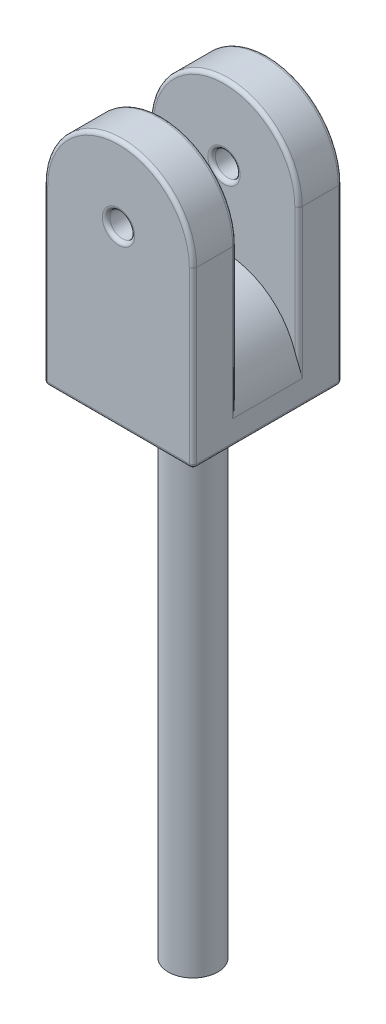
ISO-10303-21;
HEADER;
FILE_DESCRIPTION(('STEP AP214'),'2;1');
FILE_NAME('part.step','',(''),(''),'','','');
FILE_SCHEMA(('AUTOMOTIVE_DESIGN { 1 0 10303 214 1 1 1 1 }'));
ENDSEC;
DATA;
#1=APPLICATION_CONTEXT('core data for automotive mechanical design processes');
#2=APPLICATION_PROTOCOL_DEFINITION('international standard','automotive_design',2000,#1);
#3=PRODUCT_CONTEXT('',#1,'mechanical');
#4=PRODUCT('Part','Part','',(#3));
#5=PRODUCT_RELATED_PRODUCT_CATEGORY('part','',(#4));
#6=PRODUCT_DEFINITION_FORMATION('','',#4);
#7=PRODUCT_DEFINITION_CONTEXT('part definition',#1,'design');
#8=PRODUCT_DEFINITION('design','',#6,#7);
#9=PRODUCT_DEFINITION_SHAPE('','',#8);
#10=(LENGTH_UNIT() NAMED_UNIT(*) SI_UNIT(.MILLI.,.METRE.));
#11=(NAMED_UNIT(*) PLANE_ANGLE_UNIT() SI_UNIT($,.RADIAN.));
#12=(NAMED_UNIT(*) SI_UNIT($,.STERADIAN.) SOLID_ANGLE_UNIT());
#13=UNCERTAINTY_MEASURE_WITH_UNIT(LENGTH_MEASURE(1.E-05),#10,'distance_accuracy_value','');
#14=(GEOMETRIC_REPRESENTATION_CONTEXT(3) GLOBAL_UNCERTAINTY_ASSIGNED_CONTEXT((#13)) GLOBAL_UNIT_ASSIGNED_CONTEXT((#10,
#11,#12)) REPRESENTATION_CONTEXT('',''));
#15=CARTESIAN_POINT('',(0.,0.,0.));
#16=DIRECTION('',(0.,0.,1.));
#17=DIRECTION('',(1.,0.,0.));
#18=AXIS2_PLACEMENT_3D('',#15,#16,#17);
#19=CARTESIAN_POINT('',(0.,266.7,38.1));
#20=DIRECTION('',(0.,0.,-1.));
#21=DIRECTION('',(-1.,0.,0.));
#22=AXIS2_PLACEMENT_3D('',#19,#20,#21);
#23=CYLINDRICAL_SURFACE('',#22,38.1);
#24=DIRECTION('',(0.,0.,-1.));
#25=VECTOR('',#24,1.);
#26=CARTESIAN_POINT('',(-38.1,266.7,38.1));
#27=LINE('',#26,#25);
#28=CARTESIAN_POINT('',(-38.1,266.7,17.78));
#29=VERTEX_POINT('',#28);
#30=CARTESIAN_POINT('',(-38.1,266.7,-17.78));
#31=VERTEX_POINT('',#30);
#32=EDGE_CURVE('E199',#29,#31,#27,.T.);
#33=ORIENTED_EDGE('',*,*,#32,.F.);
#34=CARTESIAN_POINT('',(-36.195,278.596721186949,15.875));
#35=CARTESIAN_POINT('',(-36.2448862603018,278.444947447623,15.8750108681857));
#36=CARTESIAN_POINT('',(-36.2938137978804,278.292868526206,15.8769592555767));
#37=CARTESIAN_POINT('',(-36.3897241068165,277.988200453619,15.8843652520355));
#38=CARTESIAN_POINT('',(-36.4367070875737,277.83561135931,15.8898224822013));
#39=CARTESIAN_POINT('',(-36.5286839848045,277.530082475849,15.9038762661822));
#40=CARTESIAN_POINT('',(-36.5736790844212,277.377142953876,15.9124709236644));
#41=CARTESIAN_POINT('',(-36.661699379744,277.070881685283,15.9325007786763));
#42=CARTESIAN_POINT('',(-36.7047245123359,276.917559926581,15.9439360671393));
#43=CARTESIAN_POINT('',(-36.830733029051,276.457466338794,15.9820641228672));
#44=CARTESIAN_POINT('',(-36.9107614499138,276.150194284226,16.0125975404906));
#45=CARTESIAN_POINT('',(-37.0629235242234,275.534606271475,16.082140290408));
#46=CARTESIAN_POINT('',(-37.1350552874886,275.226290081492,16.1211516453799));
#47=CARTESIAN_POINT('',(-37.2780469393567,274.578927285856,16.2103473772654));
#48=CARTESIAN_POINT('',(-37.3481040368048,274.239802171023,16.2612486520902));
#49=CARTESIAN_POINT('',(-37.4787740019281,273.560834029528,16.3699759337929));
#50=CARTESIAN_POINT('',(-37.5393859933694,273.220990939219,16.4278025822669));
#51=CARTESIAN_POINT('',(-37.7071685223693,272.200445780582,16.6096917681534));
#52=CARTESIAN_POINT('',(-37.8002537322996,271.518872516298,16.7421424414627));
#53=CARTESIAN_POINT('',(-37.9493017219072,270.154267682289,17.0207801682615));
#54=CARTESIAN_POINT('',(-38.0052462795771,269.471235561434,17.1669739243104));
#55=CARTESIAN_POINT('',(-38.080237244788,268.104790901506,17.4659330197614));
#56=CARTESIAN_POINT('',(-38.0992977838918,267.421378608516,17.6186958193916));
#57=CARTESIAN_POINT('',(-38.099993649535,266.725398369195,17.7743207543841));
#58=CARTESIAN_POINT('',(-38.0999999986365,266.712699160467,17.7771603838626));
#59=CARTESIAN_POINT('',(-38.1,266.7,17.78));
#60=B_SPLINE_CURVE_WITH_KNOTS('',3,(#34,#35,#36,#37,#38,#39,#40,#41,#42,#43,#44,#45,#46,#47,#48,
#49,#50,#51,#52,#53,#54,#55,#56,#57,#58,#59),.UNSPECIFIED.,.F.,.F.,(4,2,2,2,2,2,2,2,2,2,2,2,4),
(0.,0.479257503484222,0.958463263068199,1.43737985799632,1.9163117858232,2.87301008050485,
3.82993687664551,4.87973141958513,5.92962329531558,8.02985519759838,10.1311167590686,
12.2315730939198,12.2706115411587),.UNSPECIFIED.);
#61=CARTESIAN_POINT('',(-36.195,278.596721186949,15.875));
#62=VERTEX_POINT('',#61);
#63=EDGE_CURVE('E316',#29,#62,#60,.F.);
#64=ORIENTED_EDGE('',*,*,#63,.T.);
#65=CARTESIAN_POINT('',(0.,266.7,15.875));
#66=DIRECTION('',(0.,0.,1.));
#67=DIRECTION('',(0.,-1.,0.));
#68=AXIS2_PLACEMENT_3D('',#65,#66,#67);
#69=CIRCLE('',#68,38.1);
#70=CARTESIAN_POINT('',(36.195,278.596721186949,15.875));
#71=VERTEX_POINT('',#70);
#72=EDGE_CURVE('E225',#71,#62,#69,.T.);
#73=ORIENTED_EDGE('',*,*,#72,.F.);
#74=CARTESIAN_POINT('',(36.195,278.596721186949,15.875));
#75=CARTESIAN_POINT('',(36.2448862603018,278.444947447623,15.8750108681857));
#76=CARTESIAN_POINT('',(36.2938137978804,278.292868526206,15.8769592555767));
#77=CARTESIAN_POINT('',(36.3897241068165,277.988200453619,15.8843652520355));
#78=CARTESIAN_POINT('',(36.4367070875737,277.83561135931,15.8898224822013));
#79=CARTESIAN_POINT('',(36.5286839848045,277.530082475849,15.9038762661822));
#80=CARTESIAN_POINT('',(36.5736790844212,277.377142953876,15.9124709236644));
#81=CARTESIAN_POINT('',(36.661699379744,277.070881685283,15.9325007786763));
#82=CARTESIAN_POINT('',(36.7047245123358,276.917559926581,15.9439360671393));
#83=CARTESIAN_POINT('',(36.830733029051,276.457466338794,15.9820641228672));
#84=CARTESIAN_POINT('',(36.9107614499137,276.150194284226,16.0125975404906));
#85=CARTESIAN_POINT('',(37.0629235242233,275.534606271475,16.082140290408));
#86=CARTESIAN_POINT('',(37.1350552874886,275.226290081492,16.1211516453799));
#87=CARTESIAN_POINT('',(37.2780469393567,274.578927285856,16.2103473772654));
#88=CARTESIAN_POINT('',(37.3481040368048,274.239802171023,16.2612486520902));
#89=CARTESIAN_POINT('',(37.478774001928,273.560834029528,16.3699759337929));
#90=CARTESIAN_POINT('',(37.5393859933694,273.220990939219,16.4278025822669));
#91=CARTESIAN_POINT('',(37.7071685223692,272.200445780582,16.6096917681534));
#92=CARTESIAN_POINT('',(37.8002537322996,271.518872516298,16.7421424414627));
#93=CARTESIAN_POINT('',(37.9493017219072,270.154267682289,17.0207801682615));
#94=CARTESIAN_POINT('',(38.0052462795771,269.471235561434,17.1669739243104));
#95=CARTESIAN_POINT('',(38.080237244788,268.104790901506,17.4659330197614));
#96=CARTESIAN_POINT('',(38.0992977838918,267.421378608516,17.6186958193916));
#97=CARTESIAN_POINT('',(38.099993649535,266.725398369195,17.7743207543841));
#98=CARTESIAN_POINT('',(38.0999999986365,266.712699160467,17.7771603838626));
#99=CARTESIAN_POINT('',(38.1,266.7,17.78));
#100=B_SPLINE_CURVE_WITH_KNOTS('',3,(#74,#75,#76,#77,#78,#79,#80,#81,#82,#83,#84,#85,#86,#87,
#88,#89,#90,#91,#92,#93,#94,#95,#96,#97,#98,#99),.UNSPECIFIED.,.F.,.F.,(4,2,2,2,2,2,2,2,2,2,2,2,
4),(0.,0.479257503484222,0.958463263068199,1.43737985799632,1.9163117858232,2.87301008050485,
3.82993687664551,4.87973141958513,5.92962329531558,8.02985519759838,10.1311167590686,
12.2315730939198,12.2706115411587),.UNSPECIFIED.);
#101=CARTESIAN_POINT('',(38.1,266.7,17.78));
#102=VERTEX_POINT('',#101);
#103=EDGE_CURVE('E11',#71,#102,#100,.T.);
#104=ORIENTED_EDGE('',*,*,#103,.T.);
#105=DIRECTION('',(0.,0.,-1.));
#106=VECTOR('',#105,1.);
#107=CARTESIAN_POINT('',(38.1,266.7,38.1));
#108=LINE('',#107,#106);
#109=CARTESIAN_POINT('',(38.1,266.7,-17.78));
#110=VERTEX_POINT('',#109);
#111=EDGE_CURVE('E220',#110,#102,#108,.F.);
#112=ORIENTED_EDGE('',*,*,#111,.F.);
#113=CARTESIAN_POINT('',(36.195,278.596721186949,-15.875));
#114=CARTESIAN_POINT('',(36.2448862603018,278.444947447623,-15.8750108681858));
#115=CARTESIAN_POINT('',(36.2938137978804,278.292868526206,-15.8769592555767));
#116=CARTESIAN_POINT('',(36.3897241068165,277.988200453619,-15.8843652520356));
#117=CARTESIAN_POINT('',(36.4367070875737,277.83561135931,-15.8898224822013));
#118=CARTESIAN_POINT('',(36.5286839848045,277.530082475849,-15.9038762661823));
#119=CARTESIAN_POINT('',(36.5736790844212,277.377142953876,-15.9124709236645));
#120=CARTESIAN_POINT('',(36.661699379744,277.070881685283,-15.9325007786763));
#121=CARTESIAN_POINT('',(36.7047245123358,276.917559926581,-15.9439360671393));
#122=CARTESIAN_POINT('',(36.830733029051,276.457466338794,-15.9820641228672));
#123=CARTESIAN_POINT('',(36.9107614499137,276.150194284226,-16.0125975404906));
#124=CARTESIAN_POINT('',(37.0629235242233,275.534606271475,-16.0821402904081));
#125=CARTESIAN_POINT('',(37.1350552874886,275.226290081492,-16.12115164538));
#126=CARTESIAN_POINT('',(37.2780469393567,274.578927285856,-16.2103473772654));
#127=CARTESIAN_POINT('',(37.3481040368048,274.239802171023,-16.2612486520902));
#128=CARTESIAN_POINT('',(37.478774001928,273.560834029528,-16.3699759337929));
#129=CARTESIAN_POINT('',(37.5393859933694,273.220990939219,-16.427802582267));
#130=CARTESIAN_POINT('',(37.7071685223692,272.200445780582,-16.6096917681535));
#131=CARTESIAN_POINT('',(37.8002537322996,271.518872516298,-16.7421424414628));
#132=CARTESIAN_POINT('',(37.9493017219072,270.154267682289,-17.0207801682616));
#133=CARTESIAN_POINT('',(38.0052462795771,269.471235561434,-17.1669739243104));
#134=CARTESIAN_POINT('',(38.080237244788,268.104790901506,-17.4659330197615));
#135=CARTESIAN_POINT('',(38.0992977838918,267.421378608516,-17.6186958193917));
#136=CARTESIAN_POINT('',(38.099993649535,266.725398369195,-17.7743207543841));
#137=CARTESIAN_POINT('',(38.0999999986365,266.712699160467,-17.7771603838626));
#138=CARTESIAN_POINT('',(38.1,266.7,-17.78));
#139=B_SPLINE_CURVE_WITH_KNOTS('',3,(#113,#114,#115,#116,#117,#118,#119,#120,#121,#122,#123,
#124,#125,#126,#127,#128,#129,#130,#131,#132,#133,#134,#135,#136,#137,#138),.UNSPECIFIED.,.F.,
.F.,(4,2,2,2,2,2,2,2,2,2,2,2,4),(0.,0.479257503484222,0.958463263068199,1.43737985799632,
1.9163117858232,2.87301008050485,3.82993687664551,4.87973141958513,5.92962329531558,
8.02985519759838,10.1311167590687,12.2315730939198,12.2706115411587),.UNSPECIFIED.);
#140=CARTESIAN_POINT('',(36.195,278.596721186949,-15.875));
#141=VERTEX_POINT('',#140);
#142=EDGE_CURVE('E47',#110,#141,#139,.F.);
#143=ORIENTED_EDGE('',*,*,#142,.T.);
#144=CARTESIAN_POINT('',(0.,266.7,-15.875));
#145=DIRECTION('',(0.,0.,-1.));
#146=DIRECTION('',(0.,1.,0.));
#147=AXIS2_PLACEMENT_3D('',#144,#145,#146);
#148=CIRCLE('',#147,38.1);
#149=CARTESIAN_POINT('',(-36.195,278.596721186949,-15.875));
#150=VERTEX_POINT('',#149);
#151=EDGE_CURVE('E222',#150,#141,#148,.T.);
#152=ORIENTED_EDGE('',*,*,#151,.F.);
#153=CARTESIAN_POINT('',(-36.195,278.596721186949,-15.875));
#154=CARTESIAN_POINT('',(-36.2448862603018,278.444947447623,-15.8750108681858));
#155=CARTESIAN_POINT('',(-36.2938137978804,278.292868526206,-15.8769592555767));
#156=CARTESIAN_POINT('',(-36.3897241068165,277.988200453619,-15.8843652520356));
#157=CARTESIAN_POINT('',(-36.4367070875737,277.83561135931,-15.8898224822013));
#158=CARTESIAN_POINT('',(-36.5286839848045,277.530082475849,-15.9038762661823));
#159=CARTESIAN_POINT('',(-36.5736790844212,277.377142953876,-15.9124709236645));
#160=CARTESIAN_POINT('',(-36.661699379744,277.070881685283,-15.9325007786763));
#161=CARTESIAN_POINT('',(-36.7047245123359,276.917559926581,-15.9439360671393));
#162=CARTESIAN_POINT('',(-36.830733029051,276.457466338794,-15.9820641228672));
#163=CARTESIAN_POINT('',(-36.9107614499138,276.150194284226,-16.0125975404906));
#164=CARTESIAN_POINT('',(-37.0629235242234,275.534606271475,-16.0821402904081));
#165=CARTESIAN_POINT('',(-37.1350552874886,275.226290081492,-16.12115164538));
#166=CARTESIAN_POINT('',(-37.2780469393567,274.578927285856,-16.2103473772654));
#167=CARTESIAN_POINT('',(-37.3481040368048,274.239802171023,-16.2612486520902));
#168=CARTESIAN_POINT('',(-37.4787740019281,273.560834029528,-16.3699759337929));
#169=CARTESIAN_POINT('',(-37.5393859933694,273.220990939219,-16.427802582267));
#170=CARTESIAN_POINT('',(-37.7071685223693,272.200445780582,-16.6096917681535));
#171=CARTESIAN_POINT('',(-37.8002537322996,271.518872516298,-16.7421424414628));
#172=CARTESIAN_POINT('',(-37.9493017219072,270.154267682289,-17.0207801682616));
#173=CARTESIAN_POINT('',(-38.0052462795771,269.471235561434,-17.1669739243104));
#174=CARTESIAN_POINT('',(-38.080237244788,268.104790901506,-17.4659330197615));
#175=CARTESIAN_POINT('',(-38.0992977838918,267.421378608516,-17.6186958193917));
#176=CARTESIAN_POINT('',(-38.099993649535,266.725398369195,-17.7743207543841));
#177=CARTESIAN_POINT('',(-38.0999999986365,266.712699160467,-17.7771603838626));
#178=CARTESIAN_POINT('',(-38.1,266.7,-17.78));
#179=B_SPLINE_CURVE_WITH_KNOTS('',3,(#153,#154,#155,#156,#157,#158,#159,#160,#161,#162,#163,
#164,#165,#166,#167,#168,#169,#170,#171,#172,#173,#174,#175,#176,#177,#178),.UNSPECIFIED.,.F.,
.F.,(4,2,2,2,2,2,2,2,2,2,2,2,4),(0.,0.479257503484222,0.958463263068199,1.43737985799632,
1.9163117858232,2.87301008050485,3.82993687664551,4.87973141958513,5.92962329531558,
8.02985519759838,10.1311167590687,12.2315730939198,12.2706115411587),.UNSPECIFIED.);
#180=EDGE_CURVE('E309',#150,#31,#179,.T.);
#181=ORIENTED_EDGE('',*,*,#180,.T.);
#182=EDGE_LOOP('',(#33,#64,#73,#104,#112,#143,#152,#181));
#183=FACE_BOUND('',#182,.T.);
#184=ADVANCED_FACE('F38',(#183),#23,.T.);
#185=CARTESIAN_POINT('',(-38.1,381.,38.1));
#186=DIRECTION('',(0.,0.,-1.));
#187=DIRECTION('',(-1.,0.,0.));
#188=AXIS2_PLACEMENT_3D('',#185,#186,#187);
#189=PLANE('',#188);
#190=CARTESIAN_POINT('',(0.,342.9,38.1));
#191=DIRECTION('',(0.,0.,-1.));
#192=DIRECTION('',(-1.,0.,0.));
#193=AXIS2_PLACEMENT_3D('',#190,#191,#192);
#194=CIRCLE('',#193,8.25500000000001);
#195=CARTESIAN_POINT('',(-8.25500000000002,342.9,38.1));
#196=VERTEX_POINT('',#195);
#197=EDGE_CURVE('E276',#196,#196,#194,.T.);
#198=ORIENTED_EDGE('',*,*,#197,.T.);
#199=EDGE_LOOP('',(#198));
#200=FACE_BOUND('',#199,.T.);
#201=CARTESIAN_POINT('',(0.,342.9,38.1));
#202=DIRECTION('',(0.,0.,-1.));
#203=DIRECTION('',(-1.,0.,0.));
#204=AXIS2_PLACEMENT_3D('',#201,#202,#203);
#205=CIRCLE('',#204,36.195);
#206=CARTESIAN_POINT('',(36.195,342.9,38.1));
#207=VERTEX_POINT('',#206);
#208=CARTESIAN_POINT('',(-36.195,342.9,38.1));
#209=VERTEX_POINT('',#208);
#210=EDGE_CURVE('E271',#207,#209,#205,.F.);
#211=ORIENTED_EDGE('',*,*,#210,.T.);
#212=DIRECTION('',(0.,-1.,0.));
#213=VECTOR('',#212,1.);
#214=CARTESIAN_POINT('',(-36.195,381.,38.1));
#215=LINE('',#214,#213);
#216=CARTESIAN_POINT('',(-36.195,255.905,38.1));
#217=VERTEX_POINT('',#216);
#218=EDGE_CURVE('E273',#209,#217,#215,.T.);
#219=ORIENTED_EDGE('',*,*,#218,.T.);
#220=DIRECTION('',(1.,0.,0.));
#221=VECTOR('',#220,1.);
#222=CARTESIAN_POINT('',(38.1,255.905,38.1));
#223=LINE('',#222,#221);
#224=CARTESIAN_POINT('',(36.195,255.905,38.1));
#225=VERTEX_POINT('',#224);
#226=EDGE_CURVE('E267',#217,#225,#223,.T.);
#227=ORIENTED_EDGE('',*,*,#226,.T.);
#228=DIRECTION('',(0.,-1.,0.));
#229=VECTOR('',#228,1.);
#230=CARTESIAN_POINT('',(36.195,381.,38.1));
#231=LINE('',#230,#229);
#232=EDGE_CURVE('E269',#225,#207,#231,.F.);
#233=ORIENTED_EDGE('',*,*,#232,.T.);
#234=EDGE_LOOP('',(#211,#219,#227,#233));
#235=FACE_BOUND('',#234,.T.);
#236=ADVANCED_FACE('F331',(#200,#235),#189,.F.);
#237=CARTESIAN_POINT('',(0.,342.9,38.1));
#238=DIRECTION('',(0.,0.,1.));
#239=DIRECTION('',(1.,0.,0.));
#240=AXIS2_PLACEMENT_3D('',#237,#238,#239);
#241=CYLINDRICAL_SURFACE('',#240,38.1);
#242=DIRECTION('',(0.,0.,1.));
#243=VECTOR('',#242,1.);
#244=CARTESIAN_POINT('',(38.1,342.9,38.1));
#245=LINE('',#244,#243);
#246=CARTESIAN_POINT('',(38.1,342.9,17.78));
#247=VERTEX_POINT('',#246);
#248=CARTESIAN_POINT('',(38.1,342.9,36.195));
#249=VERTEX_POINT('',#248);
#250=EDGE_CURVE('E210',#247,#249,#245,.T.);
#251=ORIENTED_EDGE('',*,*,#250,.F.);
#252=CARTESIAN_POINT('',(0.,342.9,17.78));
#253=DIRECTION('',(0.,0.,1.));
#254=DIRECTION('',(0.,-1.,0.));
#255=AXIS2_PLACEMENT_3D('',#252,#253,#254);
#256=CIRCLE('',#255,38.1);
#257=CARTESIAN_POINT('',(-38.1,342.9,17.78));
#258=VERTEX_POINT('',#257);
#259=EDGE_CURVE('E253',#247,#258,#256,.T.);
#260=ORIENTED_EDGE('',*,*,#259,.T.);
#261=DIRECTION('',(0.,0.,1.));
#262=VECTOR('',#261,1.);
#263=CARTESIAN_POINT('',(-38.1,342.9,38.1));
#264=LINE('',#263,#262);
#265=CARTESIAN_POINT('',(-38.1,342.9,36.195));
#266=VERTEX_POINT('',#265);
#267=EDGE_CURVE('E206',#266,#258,#264,.F.);
#268=ORIENTED_EDGE('',*,*,#267,.F.);
#269=CARTESIAN_POINT('',(0.,342.9,36.195));
#270=DIRECTION('',(0.,0.,-1.));
#271=DIRECTION('',(-1.,0.,0.));
#272=AXIS2_PLACEMENT_3D('',#269,#270,#271);
#273=CIRCLE('',#272,38.1);
#274=EDGE_CURVE('E251',#266,#249,#273,.T.);
#275=ORIENTED_EDGE('',*,*,#274,.T.);
#276=EDGE_LOOP('',(#251,#260,#268,#275));
#277=FACE_BOUND('',#276,.T.);
#278=ADVANCED_FACE('F459',(#277),#241,.T.);
#279=CARTESIAN_POINT('',(-38.1,342.9,-17.78));
#280=VERTEX_POINT('',#279);
#281=CARTESIAN_POINT('',(-38.1,342.9,-36.195));
#282=VERTEX_POINT('',#281);
#283=EDGE_CURVE('E196',#280,#282,#264,.F.);
#284=ORIENTED_EDGE('',*,*,#283,.F.);
#285=CARTESIAN_POINT('',(0.,342.9,-17.78));
#286=DIRECTION('',(0.,0.,-1.));
#287=DIRECTION('',(0.,1.,0.));
#288=AXIS2_PLACEMENT_3D('',#285,#286,#287);
#289=CIRCLE('',#288,38.1);
#290=CARTESIAN_POINT('',(38.1,342.9,-17.78));
#291=VERTEX_POINT('',#290);
#292=EDGE_CURVE('E182',#280,#291,#289,.T.);
#293=ORIENTED_EDGE('',*,*,#292,.T.);
#294=CARTESIAN_POINT('',(38.1,342.9,-36.195));
#295=VERTEX_POINT('',#294);
#296=EDGE_CURVE('E218',#295,#291,#245,.T.);
#297=ORIENTED_EDGE('',*,*,#296,.F.);
#298=CARTESIAN_POINT('',(0.,342.9,-36.195));
#299=DIRECTION('',(0.,0.,1.));
#300=DIRECTION('',(1.,0.,0.));
#301=AXIS2_PLACEMENT_3D('',#298,#299,#300);
#302=CIRCLE('',#301,38.1);
#303=EDGE_CURVE('E190',#295,#282,#302,.T.);
#304=ORIENTED_EDGE('',*,*,#303,.T.);
#305=EDGE_LOOP('',(#284,#293,#297,#304));
#306=FACE_BOUND('',#305,.T.);
#307=ADVANCED_FACE('F204',(#306),#241,.T.);
#308=CARTESIAN_POINT('',(0.,254.,0.));
#309=DIRECTION('',(0.,-1.,0.));
#310=DIRECTION('',(0.,0.,-1.));
#311=AXIS2_PLACEMENT_3D('',#308,#309,#310);
#312=CYLINDRICAL_SURFACE('',#311,12.7);
#313=CARTESIAN_POINT('',(0.,254.,0.));
#314=DIRECTION('',(0.,1.,0.));
#315=DIRECTION('',(0.,0.,1.));
#316=AXIS2_PLACEMENT_3D('',#313,#314,#315);
#317=CIRCLE('',#316,12.7);
#318=CARTESIAN_POINT('',(0.,254.,12.7));
#319=VERTEX_POINT('',#318);
#320=EDGE_CURVE('E207',#319,#319,#317,.T.);
#321=ORIENTED_EDGE('',*,*,#320,.F.);
#322=EDGE_LOOP('',(#321));
#323=FACE_BOUND('',#322,.T.);
#324=CARTESIAN_POINT('',(0.,0.,0.));
#325=DIRECTION('',(0.,1.,0.));
#326=DIRECTION('',(0.,0.,1.));
#327=AXIS2_PLACEMENT_3D('',#324,#325,#326);
#328=CIRCLE('',#327,12.7);
#329=CARTESIAN_POINT('',(0.,0.,12.7));
#330=VERTEX_POINT('',#329);
#331=EDGE_CURVE('E212',#330,#330,#328,.T.);
#332=ORIENTED_EDGE('',*,*,#331,.T.);
#333=EDGE_LOOP('',(#332));
#334=FACE_BOUND('',#333,.T.);
#335=ADVANCED_FACE('F473',(#323,#334),#312,.T.);
#336=CARTESIAN_POINT('',(0.,0.,0.));
#337=DIRECTION('',(0.,1.,0.));
#338=DIRECTION('',(0.,0.,1.));
#339=AXIS2_PLACEMENT_3D('',#336,#337,#338);
#340=PLANE('',#339);
#341=ORIENTED_EDGE('',*,*,#331,.F.);
#342=EDGE_LOOP('',(#341));
#343=FACE_BOUND('',#342,.T.);
#344=ADVANCED_FACE('F470',(#343),#340,.F.);
#345=CARTESIAN_POINT('',(38.1,381.,38.1));
#346=DIRECTION('',(-1.,0.,0.));
#347=DIRECTION('',(0.,0.,1.));
#348=AXIS2_PLACEMENT_3D('',#345,#346,#347);
#349=PLANE('',#348);
#350=ORIENTED_EDGE('',*,*,#296,.T.);
#351=DIRECTION('',(0.,1.,0.));
#352=VECTOR('',#351,1.);
#353=CARTESIAN_POINT('',(38.1,381.,-17.78));
#354=LINE('',#353,#352);
#355=EDGE_CURVE('E299',#291,#110,#354,.F.);
#356=ORIENTED_EDGE('',*,*,#355,.T.);
#357=ORIENTED_EDGE('',*,*,#111,.T.);
#358=DIRECTION('',(0.,-1.,0.));
#359=VECTOR('',#358,1.);
#360=CARTESIAN_POINT('',(38.1,381.,17.78));
#361=LINE('',#360,#359);
#362=EDGE_CURVE('E297',#102,#247,#361,.F.);
#363=ORIENTED_EDGE('',*,*,#362,.T.);
#364=ORIENTED_EDGE('',*,*,#250,.T.);
#365=DIRECTION('',(0.,-1.,0.));
#366=VECTOR('',#365,1.);
#367=CARTESIAN_POINT('',(38.1,381.,36.195));
#368=LINE('',#367,#366);
#369=CARTESIAN_POINT('',(38.1,255.905,36.195));
#370=VERTEX_POINT('',#369);
#371=EDGE_CURVE('E293',#249,#370,#368,.T.);
#372=ORIENTED_EDGE('',*,*,#371,.T.);
#373=DIRECTION('',(0.,0.,-1.));
#374=VECTOR('',#373,1.);
#375=CARTESIAN_POINT('',(38.1,255.905,-38.1));
#376=LINE('',#375,#374);
#377=CARTESIAN_POINT('',(38.1,255.905,-36.195));
#378=VERTEX_POINT('',#377);
#379=EDGE_CURVE('E291',#370,#378,#376,.T.);
#380=ORIENTED_EDGE('',*,*,#379,.T.);
#381=DIRECTION('',(0.,-1.,0.));
#382=VECTOR('',#381,1.);
#383=CARTESIAN_POINT('',(38.1,381.,-36.195));
#384=LINE('',#383,#382);
#385=EDGE_CURVE('E295',#378,#295,#384,.F.);
#386=ORIENTED_EDGE('',*,*,#385,.T.);
#387=EDGE_LOOP('',(#350,#356,#357,#363,#364,#372,#380,#386));
#388=FACE_BOUND('',#387,.T.);
#389=ADVANCED_FACE('F466',(#388),#349,.F.);
#390=CARTESIAN_POINT('',(-38.1,381.,-38.1));
#391=DIRECTION('',(0.,0.,1.));
#392=DIRECTION('',(1.,0.,0.));
#393=AXIS2_PLACEMENT_3D('',#390,#391,#392);
#394=PLANE('',#393);
#395=CARTESIAN_POINT('',(0.,342.9,-38.1));
#396=DIRECTION('',(0.,0.,1.));
#397=DIRECTION('',(1.,0.,0.));
#398=AXIS2_PLACEMENT_3D('',#395,#396,#397);
#399=CIRCLE('',#398,8.25500000000001);
#400=CARTESIAN_POINT('',(8.255,342.9,-38.1));
#401=VERTEX_POINT('',#400);
#402=EDGE_CURVE('E264',#401,#401,#399,.T.);
#403=ORIENTED_EDGE('',*,*,#402,.T.);
#404=EDGE_LOOP('',(#403));
#405=FACE_BOUND('',#404,.T.);
#406=DIRECTION('',(-1.,0.,0.));
#407=VECTOR('',#406,1.);
#408=CARTESIAN_POINT('',(-38.1,255.905,-38.1));
#409=LINE('',#408,#407);
#410=CARTESIAN_POINT('',(36.195,255.905,-38.1));
#411=VERTEX_POINT('',#410);
#412=CARTESIAN_POINT('',(-36.195,255.905,-38.1));
#413=VERTEX_POINT('',#412);
#414=EDGE_CURVE('E255',#411,#413,#409,.T.);
#415=ORIENTED_EDGE('',*,*,#414,.T.);
#416=DIRECTION('',(0.,-1.,0.));
#417=VECTOR('',#416,1.);
#418=CARTESIAN_POINT('',(-36.195,381.,-38.1));
#419=LINE('',#418,#417);
#420=CARTESIAN_POINT('',(-36.195,342.9,-38.1));
#421=VERTEX_POINT('',#420);
#422=EDGE_CURVE('E261',#413,#421,#419,.F.);
#423=ORIENTED_EDGE('',*,*,#422,.T.);
#424=CARTESIAN_POINT('',(0.,342.9,-38.1));
#425=DIRECTION('',(0.,0.,1.));
#426=DIRECTION('',(1.,0.,0.));
#427=AXIS2_PLACEMENT_3D('',#424,#425,#426);
#428=CIRCLE('',#427,36.195);
#429=CARTESIAN_POINT('',(36.195,342.9,-38.1));
#430=VERTEX_POINT('',#429);
#431=EDGE_CURVE('E259',#421,#430,#428,.F.);
#432=ORIENTED_EDGE('',*,*,#431,.T.);
#433=DIRECTION('',(0.,-1.,0.));
#434=VECTOR('',#433,1.);
#435=CARTESIAN_POINT('',(36.195,381.,-38.1));
#436=LINE('',#435,#434);
#437=EDGE_CURVE('E257',#430,#411,#436,.T.);
#438=ORIENTED_EDGE('',*,*,#437,.T.);
#439=EDGE_LOOP('',(#415,#423,#432,#438));
#440=FACE_BOUND('',#439,.T.);
#441=ADVANCED_FACE('F463',(#405,#440),#394,.F.);
#442=CARTESIAN_POINT('',(-38.1,381.,38.1));
#443=DIRECTION('',(1.,0.,0.));
#444=DIRECTION('',(0.,0.,-1.));
#445=AXIS2_PLACEMENT_3D('',#442,#443,#444);
#446=PLANE('',#445);
#447=ORIENTED_EDGE('',*,*,#32,.T.);
#448=DIRECTION('',(0.,1.,0.));
#449=VECTOR('',#448,1.);
#450=CARTESIAN_POINT('',(-38.1,381.,-17.78));
#451=LINE('',#450,#449);
#452=EDGE_CURVE('E174',#31,#280,#451,.T.);
#453=ORIENTED_EDGE('',*,*,#452,.T.);
#454=ORIENTED_EDGE('',*,*,#283,.T.);
#455=DIRECTION('',(0.,-1.,0.));
#456=VECTOR('',#455,1.);
#457=CARTESIAN_POINT('',(-38.1,381.,-36.195));
#458=LINE('',#457,#456);
#459=CARTESIAN_POINT('',(-38.1,255.905,-36.195));
#460=VERTEX_POINT('',#459);
#461=EDGE_CURVE('E232',#282,#460,#458,.T.);
#462=ORIENTED_EDGE('',*,*,#461,.T.);
#463=DIRECTION('',(0.,0.,1.));
#464=VECTOR('',#463,1.);
#465=CARTESIAN_POINT('',(-38.1,255.905,38.1));
#466=LINE('',#465,#464);
#467=CARTESIAN_POINT('',(-38.1,255.905,36.195));
#468=VERTEX_POINT('',#467);
#469=EDGE_CURVE('E228',#460,#468,#466,.T.);
#470=ORIENTED_EDGE('',*,*,#469,.T.);
#471=DIRECTION('',(0.,-1.,0.));
#472=VECTOR('',#471,1.);
#473=CARTESIAN_POINT('',(-38.1,381.,36.195));
#474=LINE('',#473,#472);
#475=EDGE_CURVE('E230',#468,#266,#474,.F.);
#476=ORIENTED_EDGE('',*,*,#475,.T.);
#477=ORIENTED_EDGE('',*,*,#267,.T.);
#478=DIRECTION('',(0.,-1.,0.));
#479=VECTOR('',#478,1.);
#480=CARTESIAN_POINT('',(-38.1,381.,17.78));
#481=LINE('',#480,#479);
#482=EDGE_CURVE('E202',#258,#29,#481,.T.);
#483=ORIENTED_EDGE('',*,*,#482,.T.);
#484=EDGE_LOOP('',(#447,#453,#454,#462,#470,#476,#477,#483));
#485=FACE_BOUND('',#484,.T.);
#486=ADVANCED_FACE('F194',(#485),#446,.F.);
#487=CARTESIAN_POINT('',(0.,254.,0.));
#488=DIRECTION('',(0.,-1.,0.));
#489=DIRECTION('',(0.,0.,-1.));
#490=AXIS2_PLACEMENT_3D('',#487,#488,#489);
#491=PLANE('',#490);
#492=DIRECTION('',(1.,0.,0.));
#493=VECTOR('',#492,1.);
#494=CARTESIAN_POINT('',(-38.1,254.,36.195));
#495=LINE('',#494,#493);
#496=CARTESIAN_POINT('',(36.195,254.,36.195));
#497=VERTEX_POINT('',#496);
#498=CARTESIAN_POINT('',(-36.195,254.,36.195));
#499=VERTEX_POINT('',#498);
#500=EDGE_CURVE('E302',#497,#499,#495,.F.);
#501=ORIENTED_EDGE('',*,*,#500,.T.);
#502=DIRECTION('',(0.,0.,1.));
#503=VECTOR('',#502,1.);
#504=CARTESIAN_POINT('',(-36.195,254.,-38.1));
#505=LINE('',#504,#503);
#506=CARTESIAN_POINT('',(-36.195,254.,-36.195));
#507=VERTEX_POINT('',#506);
#508=EDGE_CURVE('E307',#499,#507,#505,.F.);
#509=ORIENTED_EDGE('',*,*,#508,.T.);
#510=DIRECTION('',(-1.,0.,0.));
#511=VECTOR('',#510,1.);
#512=CARTESIAN_POINT('',(38.1,254.,-36.195));
#513=LINE('',#512,#511);
#514=CARTESIAN_POINT('',(36.195,254.,-36.195));
#515=VERTEX_POINT('',#514);
#516=EDGE_CURVE('E63',#507,#515,#513,.F.);
#517=ORIENTED_EDGE('',*,*,#516,.T.);
#518=DIRECTION('',(0.,0.,-1.));
#519=VECTOR('',#518,1.);
#520=CARTESIAN_POINT('',(36.195,254.,38.1));
#521=LINE('',#520,#519);
#522=EDGE_CURVE('E304',#515,#497,#521,.F.);
#523=ORIENTED_EDGE('',*,*,#522,.T.);
#524=EDGE_LOOP('',(#501,#509,#517,#523));
#525=FACE_BOUND('',#524,.T.);
#526=ORIENTED_EDGE('',*,*,#320,.T.);
#527=EDGE_LOOP('',(#526));
#528=FACE_BOUND('',#527,.T.);
#529=ADVANCED_FACE('F453',(#525,#528),#491,.T.);
#530=CARTESIAN_POINT('',(-38.1,381.,15.875));
#531=DIRECTION('',(0.,0.,1.));
#532=DIRECTION('',(0.,-1.,0.));
#533=AXIS2_PLACEMENT_3D('',#530,#531,#532);
#534=PLANE('',#533);
#535=CARTESIAN_POINT('',(0.,342.9,15.875));
#536=DIRECTION('',(0.,0.,1.));
#537=DIRECTION('',(0.,-1.,0.));
#538=AXIS2_PLACEMENT_3D('',#535,#536,#537);
#539=CIRCLE('',#538,8.25500000000001);
#540=CARTESIAN_POINT('',(0.,334.645,15.875));
#541=VERTEX_POINT('',#540);
#542=EDGE_CURVE('E248',#541,#541,#539,.T.);
#543=ORIENTED_EDGE('',*,*,#542,.T.);
#544=EDGE_LOOP('',(#543));
#545=FACE_BOUND('',#544,.T.);
#546=ORIENTED_EDGE('',*,*,#72,.T.);
#547=DIRECTION('',(0.,-1.,0.));
#548=VECTOR('',#547,1.);
#549=CARTESIAN_POINT('',(-36.195,381.,15.875));
#550=LINE('',#549,#548);
#551=CARTESIAN_POINT('',(-36.195,342.9,15.875));
#552=VERTEX_POINT('',#551);
#553=EDGE_CURVE('E246',#62,#552,#550,.F.);
#554=ORIENTED_EDGE('',*,*,#553,.T.);
#555=CARTESIAN_POINT('',(0.,342.9,15.875));
#556=DIRECTION('',(0.,0.,1.));
#557=DIRECTION('',(0.,-1.,0.));
#558=AXIS2_PLACEMENT_3D('',#555,#556,#557);
#559=CIRCLE('',#558,36.195);
#560=CARTESIAN_POINT('',(36.195,342.9,15.875));
#561=VERTEX_POINT('',#560);
#562=EDGE_CURVE('E244',#552,#561,#559,.F.);
#563=ORIENTED_EDGE('',*,*,#562,.T.);
#564=DIRECTION('',(0.,-1.,0.));
#565=VECTOR('',#564,1.);
#566=CARTESIAN_POINT('',(36.195,381.,15.875));
#567=LINE('',#566,#565);
#568=EDGE_CURVE('E189',#561,#71,#567,.T.);
#569=ORIENTED_EDGE('',*,*,#568,.T.);
#570=EDGE_LOOP('',(#546,#554,#563,#569));
#571=FACE_BOUND('',#570,.T.);
#572=ADVANCED_FACE('F449',(#545,#571),#534,.F.);
#573=CARTESIAN_POINT('',(-38.1,381.,-15.875));
#574=DIRECTION('',(0.,0.,-1.));
#575=DIRECTION('',(0.,1.,0.));
#576=AXIS2_PLACEMENT_3D('',#573,#574,#575);
#577=PLANE('',#576);
#578=CARTESIAN_POINT('',(0.,342.9,-15.875));
#579=DIRECTION('',(0.,0.,-1.));
#580=DIRECTION('',(0.,1.,0.));
#581=AXIS2_PLACEMENT_3D('',#578,#579,#580);
#582=CIRCLE('',#581,8.25500000000001);
#583=CARTESIAN_POINT('',(0.,351.155,-15.875));
#584=VERTEX_POINT('',#583);
#585=EDGE_CURVE('E239',#584,#584,#582,.T.);
#586=ORIENTED_EDGE('',*,*,#585,.T.);
#587=EDGE_LOOP('',(#586));
#588=FACE_BOUND('',#587,.T.);
#589=CARTESIAN_POINT('',(0.,342.9,-15.875));
#590=DIRECTION('',(0.,0.,-1.));
#591=DIRECTION('',(0.,1.,0.));
#592=AXIS2_PLACEMENT_3D('',#589,#590,#591);
#593=CIRCLE('',#592,36.195);
#594=CARTESIAN_POINT('',(36.195,342.9,-15.875));
#595=VERTEX_POINT('',#594);
#596=CARTESIAN_POINT('',(-36.195,342.9,-15.875));
#597=VERTEX_POINT('',#596);
#598=EDGE_CURVE('E236',#595,#597,#593,.F.);
#599=ORIENTED_EDGE('',*,*,#598,.T.);
#600=DIRECTION('',(0.,1.,0.));
#601=VECTOR('',#600,1.);
#602=CARTESIAN_POINT('',(-36.195,381.,-15.875));
#603=LINE('',#602,#601);
#604=EDGE_CURVE('E175',#597,#150,#603,.F.);
#605=ORIENTED_EDGE('',*,*,#604,.T.);
#606=ORIENTED_EDGE('',*,*,#151,.T.);
#607=DIRECTION('',(0.,1.,0.));
#608=VECTOR('',#607,1.);
#609=CARTESIAN_POINT('',(36.195,381.,-15.875));
#610=LINE('',#609,#608);
#611=EDGE_CURVE('E201',#141,#595,#610,.T.);
#612=ORIENTED_EDGE('',*,*,#611,.T.);
#613=EDGE_LOOP('',(#599,#605,#606,#612));
#614=FACE_BOUND('',#613,.T.);
#615=ADVANCED_FACE('F443',(#588,#614),#577,.F.);
#616=CARTESIAN_POINT('',(0.,342.9,38.1));
#617=DIRECTION('',(0.,0.,1.));
#618=DIRECTION('',(1.,0.,0.));
#619=AXIS2_PLACEMENT_3D('',#616,#617,#618);
#620=CYLINDRICAL_SURFACE('',#619,6.35000000000001);
#621=CARTESIAN_POINT('',(0.,342.9,17.78));
#622=DIRECTION('',(0.,0.,1.));
#623=DIRECTION('',(0.,-1.,0.));
#624=AXIS2_PLACEMENT_3D('',#621,#622,#623);
#625=CIRCLE('',#624,6.35000000000001);
#626=CARTESIAN_POINT('',(0.,336.55,17.78));
#627=VERTEX_POINT('',#626);
#628=EDGE_CURVE('E282',#627,#627,#625,.F.);
#629=ORIENTED_EDGE('',*,*,#628,.T.);
#630=EDGE_LOOP('',(#629));
#631=FACE_BOUND('',#630,.T.);
#632=CARTESIAN_POINT('',(0.,342.9,36.195));
#633=DIRECTION('',(0.,0.,-1.));
#634=DIRECTION('',(-1.,0.,0.));
#635=AXIS2_PLACEMENT_3D('',#632,#633,#634);
#636=CIRCLE('',#635,6.35000000000001);
#637=CARTESIAN_POINT('',(-6.35000000000002,342.9,36.195));
#638=VERTEX_POINT('',#637);
#639=EDGE_CURVE('E279',#638,#638,#636,.F.);
#640=ORIENTED_EDGE('',*,*,#639,.T.);
#641=EDGE_LOOP('',(#640));
#642=FACE_BOUND('',#641,.T.);
#643=ADVANCED_FACE('F437',(#631,#642),#620,.F.);
#644=CARTESIAN_POINT('',(0.,342.9,-38.1));
#645=DIRECTION('',(0.,0.,-1.));
#646=DIRECTION('',(-1.,0.,0.));
#647=AXIS2_PLACEMENT_3D('',#644,#645,#646);
#648=CYLINDRICAL_SURFACE('',#647,6.35000000000001);
#649=CARTESIAN_POINT('',(0.,342.9,-17.78));
#650=DIRECTION('',(0.,0.,-1.));
#651=DIRECTION('',(0.,1.,0.));
#652=AXIS2_PLACEMENT_3D('',#649,#650,#651);
#653=CIRCLE('',#652,6.35000000000001);
#654=CARTESIAN_POINT('',(0.,349.25,-17.78));
#655=VERTEX_POINT('',#654);
#656=EDGE_CURVE('E288',#655,#655,#653,.F.);
#657=ORIENTED_EDGE('',*,*,#656,.T.);
#658=EDGE_LOOP('',(#657));
#659=FACE_BOUND('',#658,.T.);
#660=CARTESIAN_POINT('',(0.,342.9,-36.195));
#661=DIRECTION('',(0.,0.,1.));
#662=DIRECTION('',(1.,0.,0.));
#663=AXIS2_PLACEMENT_3D('',#660,#661,#662);
#664=CIRCLE('',#663,6.35000000000001);
#665=CARTESIAN_POINT('',(6.35,342.9,-36.195));
#666=VERTEX_POINT('',#665);
#667=EDGE_CURVE('E285',#666,#666,#664,.F.);
#668=ORIENTED_EDGE('',*,*,#667,.T.);
#669=EDGE_LOOP('',(#668));
#670=FACE_BOUND('',#669,.T.);
#671=ADVANCED_FACE('F348',(#659,#670),#648,.F.);
#672=CARTESIAN_POINT('',(36.195,381.,-17.78));
#673=DIRECTION('',(0.,1.,0.));
#674=DIRECTION('',(0.,0.,1.));
#675=AXIS2_PLACEMENT_3D('',#672,#673,#674);
#676=CYLINDRICAL_SURFACE('',#675,1.905);
#677=ORIENTED_EDGE('',*,*,#142,.F.);
#678=ORIENTED_EDGE('',*,*,#355,.F.);
#679=CARTESIAN_POINT('',(36.195,342.9,-17.78));
#680=DIRECTION('',(0.,1.,0.));
#681=DIRECTION('',(0.,0.,1.));
#682=AXIS2_PLACEMENT_3D('',#679,#680,#681);
#683=CIRCLE('',#682,1.905);
#684=EDGE_CURVE('E178',#595,#291,#683,.T.);
#685=ORIENTED_EDGE('',*,*,#684,.F.);
#686=ORIENTED_EDGE('',*,*,#611,.F.);
#687=EDGE_LOOP('',(#677,#678,#685,#686));
#688=FACE_BOUND('',#687,.T.);
#689=ADVANCED_FACE('F345',(#688),#676,.T.);
#690=CARTESIAN_POINT('',(0.,342.9,-17.78));
#691=DIRECTION('',(0.,0.,-1.));
#692=DIRECTION('',(0.,1.,0.));
#693=AXIS2_PLACEMENT_3D('',#690,#691,#692);
#694=TOROIDAL_SURFACE('',#693,36.195,1.905);
#695=ORIENTED_EDGE('',*,*,#684,.T.);
#696=ORIENTED_EDGE('',*,*,#292,.F.);
#697=CARTESIAN_POINT('',(-36.195,342.9,-17.78));
#698=DIRECTION('',(0.,-1.,0.));
#699=DIRECTION('',(0.,0.,-1.));
#700=AXIS2_PLACEMENT_3D('',#697,#698,#699);
#701=CIRCLE('',#700,1.905);
#702=EDGE_CURVE('E169',#597,#280,#701,.T.);
#703=ORIENTED_EDGE('',*,*,#702,.F.);
#704=ORIENTED_EDGE('',*,*,#598,.F.);
#705=EDGE_LOOP('',(#695,#696,#703,#704));
#706=FACE_BOUND('',#705,.T.);
#707=ADVANCED_FACE('F183',(#706),#694,.T.);
#708=CARTESIAN_POINT('',(-36.195,381.,-17.78));
#709=DIRECTION('',(0.,1.,0.));
#710=DIRECTION('',(0.,0.,1.));
#711=AXIS2_PLACEMENT_3D('',#708,#709,#710);
#712=CYLINDRICAL_SURFACE('',#711,1.905);
#713=ORIENTED_EDGE('',*,*,#180,.F.);
#714=ORIENTED_EDGE('',*,*,#604,.F.);
#715=ORIENTED_EDGE('',*,*,#702,.T.);
#716=ORIENTED_EDGE('',*,*,#452,.F.);
#717=EDGE_LOOP('',(#713,#714,#715,#716));
#718=FACE_BOUND('',#717,.T.);
#719=ADVANCED_FACE('F172',(#718),#712,.T.);
#720=CARTESIAN_POINT('',(36.195,381.,17.78));
#721=DIRECTION('',(0.,-1.,0.));
#722=DIRECTION('',(0.,0.,-1.));
#723=AXIS2_PLACEMENT_3D('',#720,#721,#722);
#724=CYLINDRICAL_SURFACE('',#723,1.905);
#725=ORIENTED_EDGE('',*,*,#103,.F.);
#726=ORIENTED_EDGE('',*,*,#568,.F.);
#727=CARTESIAN_POINT('',(36.195,342.9,17.78));
#728=DIRECTION('',(0.,1.,0.));
#729=DIRECTION('',(0.,0.,1.));
#730=AXIS2_PLACEMENT_3D('',#727,#728,#729);
#731=CIRCLE('',#730,1.905);
#732=EDGE_CURVE('E179',#247,#561,#731,.T.);
#733=ORIENTED_EDGE('',*,*,#732,.F.);
#734=ORIENTED_EDGE('',*,*,#362,.F.);
#735=EDGE_LOOP('',(#725,#726,#733,#734));
#736=FACE_BOUND('',#735,.T.);
#737=ADVANCED_FACE('F358',(#736),#724,.T.);
#738=CARTESIAN_POINT('',(0.,342.9,17.78));
#739=DIRECTION('',(0.,0.,1.));
#740=DIRECTION('',(0.,-1.,0.));
#741=AXIS2_PLACEMENT_3D('',#738,#739,#740);
#742=TOROIDAL_SURFACE('',#741,36.195,1.905);
#743=ORIENTED_EDGE('',*,*,#732,.T.);
#744=ORIENTED_EDGE('',*,*,#562,.F.);
#745=CARTESIAN_POINT('',(-36.195,342.9,17.78));
#746=DIRECTION('',(0.,-1.,0.));
#747=DIRECTION('',(0.,0.,-1.));
#748=AXIS2_PLACEMENT_3D('',#745,#746,#747);
#749=CIRCLE('',#748,1.905);
#750=EDGE_CURVE('E486',#258,#552,#749,.T.);
#751=ORIENTED_EDGE('',*,*,#750,.F.);
#752=ORIENTED_EDGE('',*,*,#259,.F.);
#753=EDGE_LOOP('',(#743,#744,#751,#752));
#754=FACE_BOUND('',#753,.T.);
#755=ADVANCED_FACE('F355',(#754),#742,.T.);
#756=CARTESIAN_POINT('',(-36.195,381.,17.78));
#757=DIRECTION('',(0.,-1.,0.));
#758=DIRECTION('',(0.,0.,-1.));
#759=AXIS2_PLACEMENT_3D('',#756,#757,#758);
#760=CYLINDRICAL_SURFACE('',#759,1.905);
#761=ORIENTED_EDGE('',*,*,#750,.T.);
#762=ORIENTED_EDGE('',*,*,#553,.F.);
#763=ORIENTED_EDGE('',*,*,#63,.F.);
#764=ORIENTED_EDGE('',*,*,#482,.F.);
#765=EDGE_LOOP('',(#761,#762,#763,#764));
#766=FACE_BOUND('',#765,.T.);
#767=ADVANCED_FACE('F350',(#766),#760,.T.);
#768=CARTESIAN_POINT('',(36.195,381.,36.195));
#769=DIRECTION('',(0.,-1.,0.));
#770=DIRECTION('',(0.,0.,-1.));
#771=AXIS2_PLACEMENT_3D('',#768,#769,#770);
#772=CYLINDRICAL_SURFACE('',#771,1.905);
#773=CARTESIAN_POINT('',(36.195,255.905,36.195));
#774=DIRECTION('',(0.,-1.,0.));
#775=DIRECTION('',(0.,0.,-1.));
#776=AXIS2_PLACEMENT_3D('',#773,#774,#775);
#777=CIRCLE('',#776,1.905);
#778=EDGE_CURVE('E526',#370,#225,#777,.T.);
#779=ORIENTED_EDGE('',*,*,#778,.F.);
#780=ORIENTED_EDGE('',*,*,#371,.F.);
#781=CARTESIAN_POINT('',(36.195,342.9,36.195));
#782=DIRECTION('',(0.,1.,0.));
#783=DIRECTION('',(0.,0.,1.));
#784=AXIS2_PLACEMENT_3D('',#781,#782,#783);
#785=CIRCLE('',#784,1.905);
#786=EDGE_CURVE('E42',#207,#249,#785,.T.);
#787=ORIENTED_EDGE('',*,*,#786,.F.);
#788=ORIENTED_EDGE('',*,*,#232,.F.);
#789=EDGE_LOOP('',(#779,#780,#787,#788));
#790=FACE_BOUND('',#789,.T.);
#791=ADVANCED_FACE('F354',(#790),#772,.T.);
#792=CARTESIAN_POINT('',(0.,342.9,36.195));
#793=DIRECTION('',(0.,0.,-1.));
#794=DIRECTION('',(-1.,0.,0.));
#795=AXIS2_PLACEMENT_3D('',#792,#793,#794);
#796=TOROIDAL_SURFACE('',#795,36.195,1.905);
#797=ORIENTED_EDGE('',*,*,#786,.T.);
#798=ORIENTED_EDGE('',*,*,#274,.F.);
#799=CARTESIAN_POINT('',(-36.195,342.9,36.195));
#800=DIRECTION('',(0.,-1.,0.));
#801=DIRECTION('',(0.,0.,-1.));
#802=AXIS2_PLACEMENT_3D('',#799,#800,#801);
#803=CIRCLE('',#802,1.905);
#804=EDGE_CURVE('E524',#209,#266,#803,.T.);
#805=ORIENTED_EDGE('',*,*,#804,.F.);
#806=ORIENTED_EDGE('',*,*,#210,.F.);
#807=EDGE_LOOP('',(#797,#798,#805,#806));
#808=FACE_BOUND('',#807,.T.);
#809=ADVANCED_FACE('F411',(#808),#796,.T.);
#810=CARTESIAN_POINT('',(36.195,255.905,36.195));
#811=DIRECTION('',(0.,0.,1.));
#812=DIRECTION('',(1.,0.,0.));
#813=AXIS2_PLACEMENT_3D('',#810,#811,#812);
#814=SPHERICAL_SURFACE('',#813,1.905);
#815=CARTESIAN_POINT('',(36.195,255.905,36.195));
#816=DIRECTION('',(0.,0.,1.));
#817=DIRECTION('',(1.,0.,0.));
#818=AXIS2_PLACEMENT_3D('',#815,#816,#817);
#819=CIRCLE('',#818,1.905);
#820=EDGE_CURVE('E518',#370,#497,#819,.F.);
#821=ORIENTED_EDGE('',*,*,#820,.F.);
#822=ORIENTED_EDGE('',*,*,#778,.T.);
#823=CARTESIAN_POINT('',(36.195,255.905,36.195));
#824=DIRECTION('',(1.,0.,0.));
#825=DIRECTION('',(0.,0.,-1.));
#826=AXIS2_PLACEMENT_3D('',#823,#824,#825);
#827=CIRCLE('',#826,1.905);
#828=EDGE_CURVE('E521',#497,#225,#827,.F.);
#829=ORIENTED_EDGE('',*,*,#828,.F.);
#830=EDGE_LOOP('',(#821,#822,#829));
#831=FACE_BOUND('',#830,.T.);
#832=ADVANCED_FACE('F407',(#831),#814,.T.);
#833=CARTESIAN_POINT('',(-36.195,381.,36.195));
#834=DIRECTION('',(0.,-1.,0.));
#835=DIRECTION('',(0.,0.,-1.));
#836=AXIS2_PLACEMENT_3D('',#833,#834,#835);
#837=CYLINDRICAL_SURFACE('',#836,1.905);
#838=ORIENTED_EDGE('',*,*,#804,.T.);
#839=ORIENTED_EDGE('',*,*,#475,.F.);
#840=CARTESIAN_POINT('',(-36.195,255.905,36.195));
#841=DIRECTION('',(0.,-1.,0.));
#842=DIRECTION('',(0.,0.,-1.));
#843=AXIS2_PLACEMENT_3D('',#840,#841,#842);
#844=CIRCLE('',#843,1.905);
#845=EDGE_CURVE('E515',#217,#468,#844,.T.);
#846=ORIENTED_EDGE('',*,*,#845,.F.);
#847=ORIENTED_EDGE('',*,*,#218,.F.);
#848=EDGE_LOOP('',(#838,#839,#846,#847));
#849=FACE_BOUND('',#848,.T.);
#850=ADVANCED_FACE('F403',(#849),#837,.T.);
#851=CARTESIAN_POINT('',(-38.1,255.905,36.195));
#852=DIRECTION('',(-1.,0.,0.));
#853=DIRECTION('',(0.,0.,1.));
#854=AXIS2_PLACEMENT_3D('',#851,#852,#853);
#855=CYLINDRICAL_SURFACE('',#854,1.905);
#856=ORIENTED_EDGE('',*,*,#828,.T.);
#857=ORIENTED_EDGE('',*,*,#226,.F.);
#858=CARTESIAN_POINT('',(-36.195,255.905,36.195));
#859=DIRECTION('',(-1.,0.,0.));
#860=DIRECTION('',(0.,0.,1.));
#861=AXIS2_PLACEMENT_3D('',#858,#859,#860);
#862=CIRCLE('',#861,1.905);
#863=EDGE_CURVE('E513',#499,#217,#862,.T.);
#864=ORIENTED_EDGE('',*,*,#863,.F.);
#865=ORIENTED_EDGE('',*,*,#500,.F.);
#866=EDGE_LOOP('',(#856,#857,#864,#865));
#867=FACE_BOUND('',#866,.T.);
#868=ADVANCED_FACE('F399',(#867),#855,.T.);
#869=CARTESIAN_POINT('',(36.195,255.905,38.1));
#870=DIRECTION('',(0.,0.,1.));
#871=DIRECTION('',(1.,0.,0.));
#872=AXIS2_PLACEMENT_3D('',#869,#870,#871);
#873=CYLINDRICAL_SURFACE('',#872,1.905);
#874=ORIENTED_EDGE('',*,*,#820,.T.);
#875=ORIENTED_EDGE('',*,*,#522,.F.);
#876=CARTESIAN_POINT('',(36.195,255.905,-36.195));
#877=DIRECTION('',(0.,0.,-1.));
#878=DIRECTION('',(-1.,0.,0.));
#879=AXIS2_PLACEMENT_3D('',#876,#877,#878);
#880=CIRCLE('',#879,1.905);
#881=EDGE_CURVE('E510',#378,#515,#880,.T.);
#882=ORIENTED_EDGE('',*,*,#881,.F.);
#883=ORIENTED_EDGE('',*,*,#379,.F.);
#884=EDGE_LOOP('',(#874,#875,#882,#883));
#885=FACE_BOUND('',#884,.T.);
#886=ADVANCED_FACE('F395',(#885),#873,.T.);
#887=CARTESIAN_POINT('',(-36.195,255.905,36.195));
#888=DIRECTION('',(0.,0.,1.));
#889=DIRECTION('',(1.,0.,0.));
#890=AXIS2_PLACEMENT_3D('',#887,#888,#889);
#891=SPHERICAL_SURFACE('',#890,1.905);
#892=ORIENTED_EDGE('',*,*,#863,.T.);
#893=ORIENTED_EDGE('',*,*,#845,.T.);
#894=CARTESIAN_POINT('',(-36.195,255.905,36.195));
#895=DIRECTION('',(0.,0.,1.));
#896=DIRECTION('',(1.,0.,0.));
#897=AXIS2_PLACEMENT_3D('',#894,#895,#896);
#898=CIRCLE('',#897,1.905);
#899=EDGE_CURVE('E504',#499,#468,#898,.F.);
#900=ORIENTED_EDGE('',*,*,#899,.F.);
#901=EDGE_LOOP('',(#892,#893,#900));
#902=FACE_BOUND('',#901,.T.);
#903=ADVANCED_FACE('F391',(#902),#891,.T.);
#904=CARTESIAN_POINT('',(36.195,255.905,-36.195));
#905=DIRECTION('',(0.,0.,1.));
#906=DIRECTION('',(1.,0.,0.));
#907=AXIS2_PLACEMENT_3D('',#904,#905,#906);
#908=SPHERICAL_SURFACE('',#907,1.905);
#909=CARTESIAN_POINT('',(36.195,255.905,-36.195));
#910=DIRECTION('',(1.,0.,0.));
#911=DIRECTION('',(0.,0.,-1.));
#912=AXIS2_PLACEMENT_3D('',#909,#910,#911);
#913=CIRCLE('',#912,1.905);
#914=EDGE_CURVE('E501',#411,#515,#913,.F.);
#915=ORIENTED_EDGE('',*,*,#914,.F.);
#916=CARTESIAN_POINT('',(36.195,255.905,-36.195));
#917=DIRECTION('',(0.,-1.,0.));
#918=DIRECTION('',(0.,0.,-1.));
#919=AXIS2_PLACEMENT_3D('',#916,#917,#918);
#920=CIRCLE('',#919,1.905);
#921=EDGE_CURVE('E507',#378,#411,#920,.F.);
#922=ORIENTED_EDGE('',*,*,#921,.F.);
#923=ORIENTED_EDGE('',*,*,#881,.T.);
#924=EDGE_LOOP('',(#915,#922,#923));
#925=FACE_BOUND('',#924,.T.);
#926=ADVANCED_FACE('F387',(#925),#908,.T.);
#927=CARTESIAN_POINT('',(36.195,381.,-36.195));
#928=DIRECTION('',(0.,-1.,0.));
#929=DIRECTION('',(0.,0.,-1.));
#930=AXIS2_PLACEMENT_3D('',#927,#928,#929);
#931=CYLINDRICAL_SURFACE('',#930,1.905);
#932=ORIENTED_EDGE('',*,*,#921,.T.);
#933=ORIENTED_EDGE('',*,*,#437,.F.);
#934=CARTESIAN_POINT('',(36.195,342.9,-36.195));
#935=DIRECTION('',(0.,1.,0.));
#936=DIRECTION('',(0.,0.,1.));
#937=AXIS2_PLACEMENT_3D('',#934,#935,#936);
#938=CIRCLE('',#937,1.905);
#939=EDGE_CURVE('E498',#295,#430,#938,.T.);
#940=ORIENTED_EDGE('',*,*,#939,.F.);
#941=ORIENTED_EDGE('',*,*,#385,.F.);
#942=EDGE_LOOP('',(#932,#933,#940,#941));
#943=FACE_BOUND('',#942,.T.);
#944=ADVANCED_FACE('F383',(#943),#931,.T.);
#945=CARTESIAN_POINT('',(-36.195,255.905,38.1));
#946=DIRECTION('',(0.,0.,-1.));
#947=DIRECTION('',(-1.,0.,0.));
#948=AXIS2_PLACEMENT_3D('',#945,#946,#947);
#949=CYLINDRICAL_SURFACE('',#948,1.905);
#950=ORIENTED_EDGE('',*,*,#899,.T.);
#951=ORIENTED_EDGE('',*,*,#469,.F.);
#952=CARTESIAN_POINT('',(-36.195,255.905,-36.195));
#953=DIRECTION('',(0.,0.,-1.));
#954=DIRECTION('',(-1.,0.,0.));
#955=AXIS2_PLACEMENT_3D('',#952,#953,#954);
#956=CIRCLE('',#955,1.905);
#957=EDGE_CURVE('E496',#507,#460,#956,.T.);
#958=ORIENTED_EDGE('',*,*,#957,.F.);
#959=ORIENTED_EDGE('',*,*,#508,.F.);
#960=EDGE_LOOP('',(#950,#951,#958,#959));
#961=FACE_BOUND('',#960,.T.);
#962=ADVANCED_FACE('F379',(#961),#949,.T.);
#963=CARTESIAN_POINT('',(-38.1,255.905,-36.195));
#964=DIRECTION('',(1.,0.,0.));
#965=DIRECTION('',(0.,0.,-1.));
#966=AXIS2_PLACEMENT_3D('',#963,#964,#965);
#967=CYLINDRICAL_SURFACE('',#966,1.905);
#968=ORIENTED_EDGE('',*,*,#914,.T.);
#969=ORIENTED_EDGE('',*,*,#516,.F.);
#970=CARTESIAN_POINT('',(-36.195,255.905,-36.195));
#971=DIRECTION('',(-1.,0.,0.));
#972=DIRECTION('',(0.,0.,1.));
#973=AXIS2_PLACEMENT_3D('',#970,#971,#972);
#974=CIRCLE('',#973,1.905);
#975=EDGE_CURVE('E55',#413,#507,#974,.T.);
#976=ORIENTED_EDGE('',*,*,#975,.F.);
#977=ORIENTED_EDGE('',*,*,#414,.F.);
#978=EDGE_LOOP('',(#968,#969,#976,#977));
#979=FACE_BOUND('',#978,.T.);
#980=ADVANCED_FACE('F375',(#979),#967,.T.);
#981=CARTESIAN_POINT('',(0.,342.9,-36.195));
#982=DIRECTION('',(0.,0.,1.));
#983=DIRECTION('',(1.,0.,0.));
#984=AXIS2_PLACEMENT_3D('',#981,#982,#983);
#985=TOROIDAL_SURFACE('',#984,36.195,1.905);
#986=ORIENTED_EDGE('',*,*,#939,.T.);
#987=ORIENTED_EDGE('',*,*,#431,.F.);
#988=CARTESIAN_POINT('',(-36.195,342.9,-36.195));
#989=DIRECTION('',(0.,-1.,0.));
#990=DIRECTION('',(0.,0.,-1.));
#991=AXIS2_PLACEMENT_3D('',#988,#989,#990);
#992=CIRCLE('',#991,1.905);
#993=EDGE_CURVE('E493',#282,#421,#992,.T.);
#994=ORIENTED_EDGE('',*,*,#993,.F.);
#995=ORIENTED_EDGE('',*,*,#303,.F.);
#996=EDGE_LOOP('',(#986,#987,#994,#995));
#997=FACE_BOUND('',#996,.T.);
#998=ADVANCED_FACE('F372',(#997),#985,.T.);
#999=CARTESIAN_POINT('',(-36.195,255.905,-36.195));
#1000=DIRECTION('',(0.,0.,1.));
#1001=DIRECTION('',(1.,0.,0.));
#1002=AXIS2_PLACEMENT_3D('',#999,#1000,#1001);
#1003=SPHERICAL_SURFACE('',#1002,1.905);
#1004=ORIENTED_EDGE('',*,*,#975,.T.);
#1005=ORIENTED_EDGE('',*,*,#957,.T.);
#1006=CARTESIAN_POINT('',(-36.195,255.905,-36.195));
#1007=DIRECTION('',(0.,-1.,0.));
#1008=DIRECTION('',(0.,0.,-1.));
#1009=AXIS2_PLACEMENT_3D('',#1006,#1007,#1008);
#1010=CIRCLE('',#1009,1.905);
#1011=EDGE_CURVE('E491',#413,#460,#1010,.F.);
#1012=ORIENTED_EDGE('',*,*,#1011,.F.);
#1013=EDGE_LOOP('',(#1004,#1005,#1012));
#1014=FACE_BOUND('',#1013,.T.);
#1015=ADVANCED_FACE('F368',(#1014),#1003,.T.);
#1016=CARTESIAN_POINT('',(-36.195,381.,-36.195));
#1017=DIRECTION('',(0.,-1.,0.));
#1018=DIRECTION('',(0.,0.,-1.));
#1019=AXIS2_PLACEMENT_3D('',#1016,#1017,#1018);
#1020=CYLINDRICAL_SURFACE('',#1019,1.905);
#1021=ORIENTED_EDGE('',*,*,#993,.T.);
#1022=ORIENTED_EDGE('',*,*,#422,.F.);
#1023=ORIENTED_EDGE('',*,*,#1011,.T.);
#1024=ORIENTED_EDGE('',*,*,#461,.F.);
#1025=EDGE_LOOP('',(#1021,#1022,#1023,#1024));
#1026=FACE_BOUND('',#1025,.T.);
#1027=ADVANCED_FACE('F364',(#1026),#1020,.T.);
#1028=CARTESIAN_POINT('',(0.,342.9,17.78));
#1029=DIRECTION('',(0.,0.,1.));
#1030=DIRECTION('',(0.,-1.,0.));
#1031=AXIS2_PLACEMENT_3D('',#1028,#1029,#1030);
#1032=TOROIDAL_SURFACE('',#1031,8.25500000000001,1.905);
#1033=ORIENTED_EDGE('',*,*,#628,.F.);
#1034=EDGE_LOOP('',(#1033));
#1035=FACE_BOUND('',#1034,.T.);
#1036=ORIENTED_EDGE('',*,*,#542,.F.);
#1037=EDGE_LOOP('',(#1036));
#1038=FACE_BOUND('',#1037,.T.);
#1039=ADVANCED_FACE('F367',(#1035,#1038),#1032,.T.);
#1040=CARTESIAN_POINT('',(0.,342.9,-17.78));
#1041=DIRECTION('',(0.,0.,-1.));
#1042=DIRECTION('',(0.,1.,0.));
#1043=AXIS2_PLACEMENT_3D('',#1040,#1041,#1042);
#1044=TOROIDAL_SURFACE('',#1043,8.25500000000001,1.905);
#1045=ORIENTED_EDGE('',*,*,#656,.F.);
#1046=EDGE_LOOP('',(#1045));
#1047=FACE_BOUND('',#1046,.T.);
#1048=ORIENTED_EDGE('',*,*,#585,.F.);
#1049=EDGE_LOOP('',(#1048));
#1050=FACE_BOUND('',#1049,.T.);
#1051=ADVANCED_FACE('F421',(#1047,#1050),#1044,.T.);
#1052=CARTESIAN_POINT('',(0.,342.9,-36.195));
#1053=DIRECTION('',(0.,0.,1.));
#1054=DIRECTION('',(1.,0.,0.));
#1055=AXIS2_PLACEMENT_3D('',#1052,#1053,#1054);
#1056=TOROIDAL_SURFACE('',#1055,8.25500000000001,1.905);
#1057=ORIENTED_EDGE('',*,*,#402,.F.);
#1058=EDGE_LOOP('',(#1057));
#1059=FACE_BOUND('',#1058,.T.);
#1060=ORIENTED_EDGE('',*,*,#667,.F.);
#1061=EDGE_LOOP('',(#1060));
#1062=FACE_BOUND('',#1061,.T.);
#1063=ADVANCED_FACE('F424',(#1059,#1062),#1056,.T.);
#1064=CARTESIAN_POINT('',(0.,342.9,36.195));
#1065=DIRECTION('',(0.,0.,-1.));
#1066=DIRECTION('',(-1.,0.,0.));
#1067=AXIS2_PLACEMENT_3D('',#1064,#1065,#1066);
#1068=TOROIDAL_SURFACE('',#1067,8.25500000000001,1.905);
#1069=ORIENTED_EDGE('',*,*,#197,.F.);
#1070=EDGE_LOOP('',(#1069));
#1071=FACE_BOUND('',#1070,.T.);
#1072=ORIENTED_EDGE('',*,*,#639,.F.);
#1073=EDGE_LOOP('',(#1072));
#1074=FACE_BOUND('',#1073,.T.);
#1075=ADVANCED_FACE('F40',(#1071,#1074),#1068,.T.);
#1076=CLOSED_SHELL('',(#184,#236,#278,#307,#335,#344,#389,#441,#486,#529,#572,#615,#643,#671,
#689,#707,#719,#737,#755,#767,#791,#809,#832,#850,#868,#886,#903,#926,#944,#962,#980,#998,#1015,
#1027,#1039,#1051,#1063,#1075));
#1077=MANIFOLD_SOLID_BREP('B2',#1076);
#1078=ADVANCED_BREP_SHAPE_REPRESENTATION('',(#18,#1077),#14);
#1079=SHAPE_DEFINITION_REPRESENTATION(#9,#1078);
ENDSEC;
END-ISO-10303-21;
